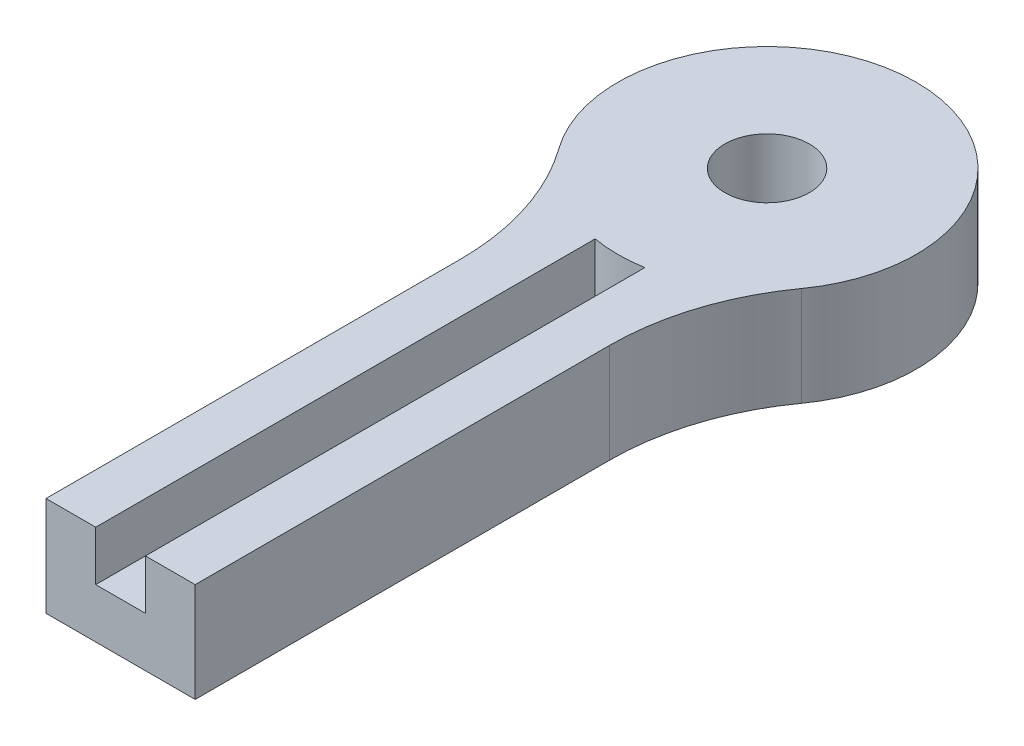
ISO-10303-21;
HEADER;
FILE_DESCRIPTION(('STEP AP214'),'2;1');
FILE_NAME('part.step','',(''),(''),'','','');
FILE_SCHEMA(('AUTOMOTIVE_DESIGN { 1 0 10303 214 1 1 1 1 }'));
ENDSEC;
DATA;
#1=APPLICATION_CONTEXT('core data for automotive mechanical design processes');
#2=APPLICATION_PROTOCOL_DEFINITION('international standard','automotive_design',2000,#1);
#3=PRODUCT_CONTEXT('',#1,'mechanical');
#4=PRODUCT('Part','Part','',(#3));
#5=PRODUCT_RELATED_PRODUCT_CATEGORY('part','',(#4));
#6=PRODUCT_DEFINITION_FORMATION('','',#4);
#7=PRODUCT_DEFINITION_CONTEXT('part definition',#1,'design');
#8=PRODUCT_DEFINITION('design','',#6,#7);
#9=PRODUCT_DEFINITION_SHAPE('','',#8);
#10=(LENGTH_UNIT() NAMED_UNIT(*) SI_UNIT(.MILLI.,.METRE.));
#11=(NAMED_UNIT(*) PLANE_ANGLE_UNIT() SI_UNIT($,.RADIAN.));
#12=(NAMED_UNIT(*) SI_UNIT($,.STERADIAN.) SOLID_ANGLE_UNIT());
#13=UNCERTAINTY_MEASURE_WITH_UNIT(LENGTH_MEASURE(1.E-05),#10,'distance_accuracy_value','');
#14=(GEOMETRIC_REPRESENTATION_CONTEXT(3) GLOBAL_UNCERTAINTY_ASSIGNED_CONTEXT((#13)) GLOBAL_UNIT_ASSIGNED_CONTEXT((#10,
#11,#12)) REPRESENTATION_CONTEXT('',''));
#15=CARTESIAN_POINT('',(0.,0.,0.));
#16=DIRECTION('',(0.,0.,1.));
#17=DIRECTION('',(1.,0.,0.));
#18=AXIS2_PLACEMENT_3D('',#15,#16,#17);
#19=CARTESIAN_POINT('',(0.,2.,0.));
#20=DIRECTION('',(0.,1.,0.));
#21=DIRECTION('',(0.,0.,1.));
#22=AXIS2_PLACEMENT_3D('',#19,#20,#21);
#23=PLANE('',#22);
#24=DIRECTION('',(0.,0.,1.));
#25=VECTOR('',#24,1.);
#26=CARTESIAN_POINT('',(1.,2.,26.));
#27=LINE('',#26,#25);
#28=CARTESIAN_POINT('',(1.,2.,5.91607978309962));
#29=VERTEX_POINT('',#28);
#30=CARTESIAN_POINT('',(1.,2.,26.));
#31=VERTEX_POINT('',#30);
#32=EDGE_CURVE('E144',#29,#31,#27,.T.);
#33=ORIENTED_EDGE('',*,*,#32,.F.);
#34=CARTESIAN_POINT('',(0.,2.,0.));
#35=DIRECTION('',(0.,1.,0.));
#36=DIRECTION('',(0.,0.,1.));
#37=AXIS2_PLACEMENT_3D('',#34,#35,#36);
#38=CIRCLE('',#37,6.);
#39=CARTESIAN_POINT('',(-1.,2.,5.91607978309962));
#40=VERTEX_POINT('',#39);
#41=EDGE_CURVE('E129',#40,#29,#38,.T.);
#42=ORIENTED_EDGE('',*,*,#41,.F.);
#43=DIRECTION('',(0.,0.,-1.));
#44=VECTOR('',#43,1.);
#45=CARTESIAN_POINT('',(-1.,2.,5.19615242270663));
#46=LINE('',#45,#44);
#47=CARTESIAN_POINT('',(-0.999999999999998,2.,26.));
#48=VERTEX_POINT('',#47);
#49=EDGE_CURVE('E150',#48,#40,#46,.T.);
#50=ORIENTED_EDGE('',*,*,#49,.F.);
#51=DIRECTION('',(1.,0.,0.));
#52=VECTOR('',#51,1.);
#53=CARTESIAN_POINT('',(0.,2.,26.));
#54=LINE('',#53,#52);
#55=EDGE_CURVE('E162',#48,#31,#54,.T.);
#56=ORIENTED_EDGE('',*,*,#55,.T.);
#57=EDGE_LOOP('',(#33,#42,#50,#56));
#58=FACE_BOUND('',#57,.T.);
#59=ADVANCED_FACE('F35',(#58),#23,.T.);
#60=CARTESIAN_POINT('',(-1.,4.,5.19615242270663));
#61=DIRECTION('',(-1.,0.,0.));
#62=DIRECTION('',(0.,0.,1.));
#63=AXIS2_PLACEMENT_3D('',#60,#61,#62);
#64=PLANE('',#63);
#65=DIRECTION('',(0.,-1.,0.));
#66=VECTOR('',#65,1.);
#67=CARTESIAN_POINT('',(-1.,4.,5.91607978309962));
#68=LINE('',#67,#66);
#69=CARTESIAN_POINT('',(-1.,4.,5.91607978309962));
#70=VERTEX_POINT('',#69);
#71=EDGE_CURVE('E130',#70,#40,#68,.T.);
#72=ORIENTED_EDGE('',*,*,#71,.F.);
#73=DIRECTION('',(0.,0.,-1.));
#74=VECTOR('',#73,1.);
#75=CARTESIAN_POINT('',(-1.,4.,5.19615242270663));
#76=LINE('',#75,#74);
#77=CARTESIAN_POINT('',(-0.999999999999997,4.,26.));
#78=VERTEX_POINT('',#77);
#79=EDGE_CURVE('E137',#78,#70,#76,.T.);
#80=ORIENTED_EDGE('',*,*,#79,.F.);
#81=DIRECTION('',(0.,-1.,0.));
#82=VECTOR('',#81,1.);
#83=CARTESIAN_POINT('',(-0.999999999999997,4.,26.));
#84=LINE('',#83,#82);
#85=EDGE_CURVE('E156',#78,#48,#84,.T.);
#86=ORIENTED_EDGE('',*,*,#85,.T.);
#87=ORIENTED_EDGE('',*,*,#49,.T.);
#88=EDGE_LOOP('',(#72,#80,#86,#87));
#89=FACE_BOUND('',#88,.T.);
#90=ADVANCED_FACE('F214',(#89),#64,.F.);
#91=CARTESIAN_POINT('',(1.,4.,26.));
#92=DIRECTION('',(1.,0.,0.));
#93=DIRECTION('',(0.,0.,-1.));
#94=AXIS2_PLACEMENT_3D('',#91,#92,#93);
#95=PLANE('',#94);
#96=DIRECTION('',(0.,-1.,0.));
#97=VECTOR('',#96,1.);
#98=CARTESIAN_POINT('',(1.,4.,5.91607978309962));
#99=LINE('',#98,#97);
#100=CARTESIAN_POINT('',(1.,4.,5.91607978309962));
#101=VERTEX_POINT('',#100);
#102=EDGE_CURVE('E113',#29,#101,#99,.F.);
#103=ORIENTED_EDGE('',*,*,#102,.F.);
#104=ORIENTED_EDGE('',*,*,#32,.T.);
#105=DIRECTION('',(0.,-1.,0.));
#106=VECTOR('',#105,1.);
#107=CARTESIAN_POINT('',(1.,4.,26.));
#108=LINE('',#107,#106);
#109=CARTESIAN_POINT('',(1.,4.,26.));
#110=VERTEX_POINT('',#109);
#111=EDGE_CURVE('E116',#110,#31,#108,.T.);
#112=ORIENTED_EDGE('',*,*,#111,.F.);
#113=DIRECTION('',(0.,0.,1.));
#114=VECTOR('',#113,1.);
#115=CARTESIAN_POINT('',(1.,4.,26.));
#116=LINE('',#115,#114);
#117=EDGE_CURVE('E110',#101,#110,#116,.T.);
#118=ORIENTED_EDGE('',*,*,#117,.F.);
#119=EDGE_LOOP('',(#103,#104,#112,#118));
#120=FACE_BOUND('',#119,.T.);
#121=ADVANCED_FACE('F112',(#120),#95,.F.);
#122=CARTESIAN_POINT('',(-3.,2.,0.));
#123=DIRECTION('',(-1.,0.,0.));
#124=DIRECTION('',(0.,0.,1.));
#125=AXIS2_PLACEMENT_3D('',#122,#123,#124);
#126=PLANE('',#125);
#127=DIRECTION('',(0.,0.,1.));
#128=VECTOR('',#127,1.);
#129=CARTESIAN_POINT('',(-3.,4.,26.));
#130=LINE('',#129,#128);
#131=CARTESIAN_POINT('',(-3.,4.,9.32737905308882));
#132=VERTEX_POINT('',#131);
#133=CARTESIAN_POINT('',(-3.,4.,26.));
#134=VERTEX_POINT('',#133);
#135=EDGE_CURVE('E154',#132,#134,#130,.T.);
#136=ORIENTED_EDGE('',*,*,#135,.F.);
#137=DIRECTION('',(0.,-1.,0.));
#138=VECTOR('',#137,1.);
#139=CARTESIAN_POINT('',(-3.,2.,9.32737905308882));
#140=LINE('',#139,#138);
#141=CARTESIAN_POINT('',(-3.,0.,9.32737905308882));
#142=VERTEX_POINT('',#141);
#143=EDGE_CURVE('E190',#132,#142,#140,.T.);
#144=ORIENTED_EDGE('',*,*,#143,.T.);
#145=DIRECTION('',(0.,0.,-1.));
#146=VECTOR('',#145,1.);
#147=CARTESIAN_POINT('',(-3.,0.,0.));
#148=LINE('',#147,#146);
#149=CARTESIAN_POINT('',(-3.,0.,26.));
#150=VERTEX_POINT('',#149);
#151=EDGE_CURVE('E161',#150,#142,#148,.T.);
#152=ORIENTED_EDGE('',*,*,#151,.F.);
#153=DIRECTION('',(0.,-1.,0.));
#154=VECTOR('',#153,1.);
#155=CARTESIAN_POINT('',(-3.,2.,26.));
#156=LINE('',#155,#154);
#157=EDGE_CURVE('E181',#134,#150,#156,.T.);
#158=ORIENTED_EDGE('',*,*,#157,.F.);
#159=EDGE_LOOP('',(#136,#144,#152,#158));
#160=FACE_BOUND('',#159,.T.);
#161=ADVANCED_FACE('F206',(#160),#126,.T.);
#162=CARTESIAN_POINT('',(0.,2.,26.));
#163=DIRECTION('',(0.,0.,-1.));
#164=DIRECTION('',(-1.,0.,0.));
#165=AXIS2_PLACEMENT_3D('',#162,#163,#164);
#166=PLANE('',#165);
#167=DIRECTION('',(1.,0.,0.));
#168=VECTOR('',#167,1.);
#169=CARTESIAN_POINT('',(0.,0.,26.));
#170=LINE('',#169,#168);
#171=CARTESIAN_POINT('',(3.,0.,26.));
#172=VERTEX_POINT('',#171);
#173=EDGE_CURVE('E169',#150,#172,#170,.T.);
#174=ORIENTED_EDGE('',*,*,#173,.T.);
#175=DIRECTION('',(0.,-1.,0.));
#176=VECTOR('',#175,1.);
#177=CARTESIAN_POINT('',(3.,2.,26.));
#178=LINE('',#177,#176);
#179=CARTESIAN_POINT('',(3.,4.,26.));
#180=VERTEX_POINT('',#179);
#181=EDGE_CURVE('E165',#180,#172,#178,.T.);
#182=ORIENTED_EDGE('',*,*,#181,.F.);
#183=DIRECTION('',(1.,0.,0.));
#184=VECTOR('',#183,1.);
#185=CARTESIAN_POINT('',(3.,4.,26.));
#186=LINE('',#185,#184);
#187=EDGE_CURVE('E120',#110,#180,#186,.T.);
#188=ORIENTED_EDGE('',*,*,#187,.F.);
#189=ORIENTED_EDGE('',*,*,#111,.T.);
#190=ORIENTED_EDGE('',*,*,#55,.F.);
#191=ORIENTED_EDGE('',*,*,#85,.F.);
#192=DIRECTION('',(1.,0.,0.));
#193=VECTOR('',#192,1.);
#194=CARTESIAN_POINT('',(-0.999999999999997,4.,26.));
#195=LINE('',#194,#193);
#196=EDGE_CURVE('E151',#134,#78,#195,.T.);
#197=ORIENTED_EDGE('',*,*,#196,.F.);
#198=ORIENTED_EDGE('',*,*,#157,.T.);
#199=EDGE_LOOP('',(#174,#182,#188,#189,#190,#191,#197,#198));
#200=FACE_BOUND('',#199,.T.);
#201=ADVANCED_FACE('F212',(#200),#166,.F.);
#202=CARTESIAN_POINT('',(3.,2.,0.));
#203=DIRECTION('',(-1.,0.,0.));
#204=DIRECTION('',(0.,0.,1.));
#205=AXIS2_PLACEMENT_3D('',#202,#203,#204);
#206=PLANE('',#205);
#207=DIRECTION('',(0.,0.,-1.));
#208=VECTOR('',#207,1.);
#209=CARTESIAN_POINT('',(3.,0.,0.));
#210=LINE('',#209,#208);
#211=CARTESIAN_POINT('',(3.,0.,9.32737905308881));
#212=VERTEX_POINT('',#211);
#213=EDGE_CURVE('E171',#172,#212,#210,.T.);
#214=ORIENTED_EDGE('',*,*,#213,.T.);
#215=DIRECTION('',(0.,1.,0.));
#216=VECTOR('',#215,1.);
#217=CARTESIAN_POINT('',(3.,4.,9.32737905308881));
#218=LINE('',#217,#216);
#219=CARTESIAN_POINT('',(3.,4.,9.32737905308881));
#220=VERTEX_POINT('',#219);
#221=EDGE_CURVE('E188',#212,#220,#218,.T.);
#222=ORIENTED_EDGE('',*,*,#221,.T.);
#223=DIRECTION('',(0.,0.,-1.));
#224=VECTOR('',#223,1.);
#225=CARTESIAN_POINT('',(3.,4.,5.19615242270663));
#226=LINE('',#225,#224);
#227=EDGE_CURVE('E121',#180,#220,#226,.T.);
#228=ORIENTED_EDGE('',*,*,#227,.F.);
#229=ORIENTED_EDGE('',*,*,#181,.T.);
#230=EDGE_LOOP('',(#214,#222,#228,#229));
#231=FACE_BOUND('',#230,.T.);
#232=ADVANCED_FACE('F219',(#231),#206,.F.);
#233=CARTESIAN_POINT('',(0.,2.,0.));
#234=DIRECTION('',(0.,-1.,0.));
#235=DIRECTION('',(0.,0.,-1.));
#236=AXIS2_PLACEMENT_3D('',#233,#234,#235);
#237=CYLINDRICAL_SURFACE('',#236,6.);
#238=CARTESIAN_POINT('',(0.,4.,0.));
#239=DIRECTION('',(0.,1.,0.));
#240=DIRECTION('',(0.,0.,1.));
#241=AXIS2_PLACEMENT_3D('',#238,#239,#240);
#242=CIRCLE('',#241,6.);
#243=CARTESIAN_POINT('',(4.875,4.,3.4977671449083));
#244=VERTEX_POINT('',#243);
#245=CARTESIAN_POINT('',(-4.875,4.,3.49776714490831));
#246=VERTEX_POINT('',#245);
#247=EDGE_CURVE('E131',#244,#246,#242,.T.);
#248=ORIENTED_EDGE('',*,*,#247,.F.);
#249=DIRECTION('',(0.,-1.,0.));
#250=VECTOR('',#249,1.);
#251=CARTESIAN_POINT('',(4.875,2.,3.4977671449083));
#252=LINE('',#251,#250);
#253=CARTESIAN_POINT('',(4.875,0.,3.4977671449083));
#254=VERTEX_POINT('',#253);
#255=EDGE_CURVE('E185',#244,#254,#252,.T.);
#256=ORIENTED_EDGE('',*,*,#255,.T.);
#257=CARTESIAN_POINT('',(0.,0.,0.));
#258=DIRECTION('',(0.,1.,0.));
#259=DIRECTION('',(0.,0.,1.));
#260=AXIS2_PLACEMENT_3D('',#257,#258,#259);
#261=CIRCLE('',#260,6.);
#262=CARTESIAN_POINT('',(-4.875,0.,3.49776714490831));
#263=VERTEX_POINT('',#262);
#264=EDGE_CURVE('E174',#254,#263,#261,.T.);
#265=ORIENTED_EDGE('',*,*,#264,.T.);
#266=DIRECTION('',(0.,-1.,0.));
#267=VECTOR('',#266,1.);
#268=CARTESIAN_POINT('',(-4.875,2.,3.49776714490831));
#269=LINE('',#268,#267);
#270=EDGE_CURVE('E183',#263,#246,#269,.F.);
#271=ORIENTED_EDGE('',*,*,#270,.T.);
#272=EDGE_LOOP('',(#248,#256,#265,#271));
#273=FACE_BOUND('',#272,.T.);
#274=ADVANCED_FACE('F203',(#273),#237,.T.);
#275=CARTESIAN_POINT('',(0.,2.,0.));
#276=DIRECTION('',(0.,-1.,0.));
#277=DIRECTION('',(0.,0.,-1.));
#278=AXIS2_PLACEMENT_3D('',#275,#276,#277);
#279=CYLINDRICAL_SURFACE('',#278,1.7);
#280=CARTESIAN_POINT('',(0.,0.,0.));
#281=DIRECTION('',(0.,1.,0.));
#282=DIRECTION('',(0.,0.,1.));
#283=AXIS2_PLACEMENT_3D('',#280,#281,#282);
#284=CIRCLE('',#283,1.7);
#285=CARTESIAN_POINT('',(0.,0.,1.7));
#286=VERTEX_POINT('',#285);
#287=EDGE_CURVE('E166',#286,#286,#284,.T.);
#288=ORIENTED_EDGE('',*,*,#287,.F.);
#289=EDGE_LOOP('',(#288));
#290=FACE_BOUND('',#289,.T.);
#291=CARTESIAN_POINT('',(0.,4.,0.));
#292=DIRECTION('',(0.,1.,0.));
#293=DIRECTION('',(0.,0.,1.));
#294=AXIS2_PLACEMENT_3D('',#291,#292,#293);
#295=CIRCLE('',#294,1.7);
#296=CARTESIAN_POINT('',(0.,4.,1.7));
#297=VERTEX_POINT('',#296);
#298=EDGE_CURVE('E139',#297,#297,#295,.T.);
#299=ORIENTED_EDGE('',*,*,#298,.T.);
#300=EDGE_LOOP('',(#299));
#301=FACE_BOUND('',#300,.T.);
#302=ADVANCED_FACE('F241',(#290,#301),#279,.F.);
#303=CARTESIAN_POINT('',(0.,0.,0.));
#304=DIRECTION('',(0.,1.,0.));
#305=DIRECTION('',(0.,0.,1.));
#306=AXIS2_PLACEMENT_3D('',#303,#304,#305);
#307=PLANE('',#306);
#308=ORIENTED_EDGE('',*,*,#151,.T.);
#309=CARTESIAN_POINT('',(-13.,0.,9.32737905308882));
#310=DIRECTION('',(0.,1.,0.));
#311=DIRECTION('',(0.,0.,1.));
#312=AXIS2_PLACEMENT_3D('',#309,#310,#311);
#313=CIRCLE('',#312,10.);
#314=EDGE_CURVE('E43',#142,#263,#313,.T.);
#315=ORIENTED_EDGE('',*,*,#314,.T.);
#316=ORIENTED_EDGE('',*,*,#264,.F.);
#317=CARTESIAN_POINT('',(13.,0.,9.32737905308881));
#318=DIRECTION('',(0.,1.,0.));
#319=DIRECTION('',(0.,0.,1.));
#320=AXIS2_PLACEMENT_3D('',#317,#318,#319);
#321=CIRCLE('',#320,10.);
#322=EDGE_CURVE('E192',#254,#212,#321,.T.);
#323=ORIENTED_EDGE('',*,*,#322,.T.);
#324=ORIENTED_EDGE('',*,*,#213,.F.);
#325=ORIENTED_EDGE('',*,*,#173,.F.);
#326=EDGE_LOOP('',(#308,#315,#316,#323,#324,#325));
#327=FACE_BOUND('',#326,.T.);
#328=ORIENTED_EDGE('',*,*,#287,.T.);
#329=EDGE_LOOP('',(#328));
#330=FACE_BOUND('',#329,.T.);
#331=ADVANCED_FACE('F197',(#327,#330),#307,.F.);
#332=CARTESIAN_POINT('',(0.,4.,0.));
#333=DIRECTION('',(0.,-1.,0.));
#334=DIRECTION('',(0.,0.,-1.));
#335=AXIS2_PLACEMENT_3D('',#332,#333,#334);
#336=PLANE('',#335);
#337=ORIENTED_EDGE('',*,*,#79,.T.);
#338=EDGE_CURVE('E128',#70,#101,#242,.T.);
#339=ORIENTED_EDGE('',*,*,#338,.T.);
#340=ORIENTED_EDGE('',*,*,#117,.T.);
#341=ORIENTED_EDGE('',*,*,#187,.T.);
#342=ORIENTED_EDGE('',*,*,#227,.T.);
#343=CARTESIAN_POINT('',(13.,4.,9.32737905308881));
#344=DIRECTION('',(0.,-1.,0.));
#345=DIRECTION('',(0.,0.,-1.));
#346=AXIS2_PLACEMENT_3D('',#343,#344,#345);
#347=CIRCLE('',#346,10.);
#348=EDGE_CURVE('E194',#220,#244,#347,.T.);
#349=ORIENTED_EDGE('',*,*,#348,.T.);
#350=ORIENTED_EDGE('',*,*,#247,.T.);
#351=CARTESIAN_POINT('',(-13.,4.,9.32737905308882));
#352=DIRECTION('',(0.,-1.,0.));
#353=DIRECTION('',(0.,0.,-1.));
#354=AXIS2_PLACEMENT_3D('',#351,#352,#353);
#355=CIRCLE('',#354,10.);
#356=EDGE_CURVE('E11',#246,#132,#355,.T.);
#357=ORIENTED_EDGE('',*,*,#356,.T.);
#358=ORIENTED_EDGE('',*,*,#135,.T.);
#359=ORIENTED_EDGE('',*,*,#196,.T.);
#360=EDGE_LOOP('',(#337,#339,#340,#341,#342,#349,#350,#357,#358,#359));
#361=FACE_BOUND('',#360,.T.);
#362=ORIENTED_EDGE('',*,*,#298,.F.);
#363=EDGE_LOOP('',(#362));
#364=FACE_BOUND('',#363,.T.);
#365=ADVANCED_FACE('F134',(#361,#364),#336,.F.);
#366=CARTESIAN_POINT('',(0.,4.,0.));
#367=DIRECTION('',(0.,-1.,0.));
#368=DIRECTION('',(0.,0.,-1.));
#369=AXIS2_PLACEMENT_3D('',#366,#367,#368);
#370=CYLINDRICAL_SURFACE('',#369,6.);
#371=ORIENTED_EDGE('',*,*,#338,.F.);
#372=ORIENTED_EDGE('',*,*,#71,.T.);
#373=ORIENTED_EDGE('',*,*,#41,.T.);
#374=ORIENTED_EDGE('',*,*,#102,.T.);
#375=EDGE_LOOP('',(#371,#372,#373,#374));
#376=FACE_BOUND('',#375,.T.);
#377=ADVANCED_FACE('F126',(#376),#370,.T.);
#378=CARTESIAN_POINT('',(13.,2.,9.32737905308881));
#379=DIRECTION('',(0.,-1.,0.));
#380=DIRECTION('',(0.,0.,-1.));
#381=AXIS2_PLACEMENT_3D('',#378,#379,#380);
#382=CYLINDRICAL_SURFACE('',#381,10.);
#383=ORIENTED_EDGE('',*,*,#348,.F.);
#384=ORIENTED_EDGE('',*,*,#221,.F.);
#385=ORIENTED_EDGE('',*,*,#322,.F.);
#386=ORIENTED_EDGE('',*,*,#255,.F.);
#387=EDGE_LOOP('',(#383,#384,#385,#386));
#388=FACE_BOUND('',#387,.T.);
#389=ADVANCED_FACE('F223',(#388),#382,.F.);
#390=CARTESIAN_POINT('',(-13.,2.,9.32737905308882));
#391=DIRECTION('',(0.,-1.,0.));
#392=DIRECTION('',(0.,0.,-1.));
#393=AXIS2_PLACEMENT_3D('',#390,#391,#392);
#394=CYLINDRICAL_SURFACE('',#393,10.);
#395=ORIENTED_EDGE('',*,*,#356,.F.);
#396=ORIENTED_EDGE('',*,*,#270,.F.);
#397=ORIENTED_EDGE('',*,*,#314,.F.);
#398=ORIENTED_EDGE('',*,*,#143,.F.);
#399=EDGE_LOOP('',(#395,#396,#397,#398));
#400=FACE_BOUND('',#399,.T.);
#401=ADVANCED_FACE('F37',(#400),#394,.F.);
#402=CLOSED_SHELL('',(#59,#90,#121,#161,#201,#232,#274,#302,#331,#365,#377,#389,#401));
#403=MANIFOLD_SOLID_BREP('B2',#402);
#404=ADVANCED_BREP_SHAPE_REPRESENTATION('',(#18,#403),#14);
#405=SHAPE_DEFINITION_REPRESENTATION(#9,#404);
ENDSEC;
END-ISO-10303-21;
